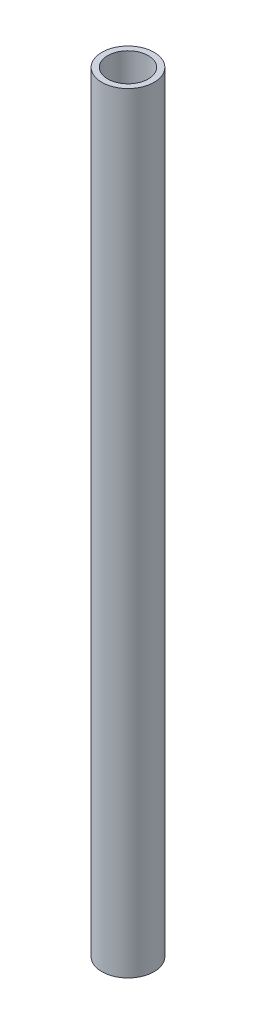
ISO-10303-21;
HEADER;
FILE_DESCRIPTION(('STEP AP214'),'2;1');
FILE_NAME('part.step','',(''),(''),'','','');
FILE_SCHEMA(('AUTOMOTIVE_DESIGN { 1 0 10303 214 1 1 1 1 }'));
ENDSEC;
DATA;
#1=APPLICATION_CONTEXT('core data for automotive mechanical design processes');
#2=APPLICATION_PROTOCOL_DEFINITION('international standard','automotive_design',2000,#1);
#3=PRODUCT_CONTEXT('',#1,'mechanical');
#4=PRODUCT('Part','Part','',(#3));
#5=PRODUCT_RELATED_PRODUCT_CATEGORY('part','',(#4));
#6=PRODUCT_DEFINITION_FORMATION('','',#4);
#7=PRODUCT_DEFINITION_CONTEXT('part definition',#1,'design');
#8=PRODUCT_DEFINITION('design','',#6,#7);
#9=PRODUCT_DEFINITION_SHAPE('','',#8);
#10=(LENGTH_UNIT() NAMED_UNIT(*) SI_UNIT(.MILLI.,.METRE.));
#11=(NAMED_UNIT(*) PLANE_ANGLE_UNIT() SI_UNIT($,.RADIAN.));
#12=(NAMED_UNIT(*) SI_UNIT($,.STERADIAN.) SOLID_ANGLE_UNIT());
#13=UNCERTAINTY_MEASURE_WITH_UNIT(LENGTH_MEASURE(1.E-05),#10,'distance_accuracy_value','');
#14=(GEOMETRIC_REPRESENTATION_CONTEXT(3) GLOBAL_UNCERTAINTY_ASSIGNED_CONTEXT((#13)) GLOBAL_UNIT_ASSIGNED_CONTEXT((#10,
#11,#12)) REPRESENTATION_CONTEXT('',''));
#15=CARTESIAN_POINT('',(0.,0.,0.));
#16=DIRECTION('',(0.,0.,1.));
#17=DIRECTION('',(1.,0.,0.));
#18=AXIS2_PLACEMENT_3D('',#15,#16,#17);
#19=CARTESIAN_POINT('',(0.,265.82,0.));
#20=DIRECTION('',(0.,1.,0.));
#21=DIRECTION('',(0.,0.,1.));
#22=AXIS2_PLACEMENT_3D('',#19,#20,#21);
#23=PLANE('',#22);
#24=CARTESIAN_POINT('',(0.,265.82,0.));
#25=DIRECTION('',(0.,1.,0.));
#26=DIRECTION('',(0.,0.,1.));
#27=AXIS2_PLACEMENT_3D('',#24,#25,#26);
#28=CIRCLE('',#27,9.);
#29=CARTESIAN_POINT('',(0.,265.82,9.));
#30=VERTEX_POINT('',#29);
#31=EDGE_CURVE('E10',#30,#30,#28,.T.);
#32=ORIENTED_EDGE('',*,*,#31,.T.);
#33=EDGE_LOOP('',(#32));
#34=FACE_BOUND('',#33,.T.);
#35=CARTESIAN_POINT('',(0.,265.82,0.));
#36=DIRECTION('',(0.,1.,0.));
#37=DIRECTION('',(0.,0.,1.));
#38=AXIS2_PLACEMENT_3D('',#35,#36,#37);
#39=CIRCLE('',#38,7.);
#40=CARTESIAN_POINT('',(0.,265.82,7.));
#41=VERTEX_POINT('',#40);
#42=EDGE_CURVE('E41',#41,#41,#39,.T.);
#43=ORIENTED_EDGE('',*,*,#42,.F.);
#44=EDGE_LOOP('',(#43));
#45=FACE_BOUND('',#44,.T.);
#46=ADVANCED_FACE('F30',(#34,#45),#23,.T.);
#47=CARTESIAN_POINT('',(0.,0.,0.));
#48=DIRECTION('',(0.,1.,0.));
#49=DIRECTION('',(0.,0.,1.));
#50=AXIS2_PLACEMENT_3D('',#47,#48,#49);
#51=PLANE('',#50);
#52=CARTESIAN_POINT('',(0.,0.,0.));
#53=DIRECTION('',(0.,1.,0.));
#54=DIRECTION('',(0.,0.,1.));
#55=AXIS2_PLACEMENT_3D('',#52,#53,#54);
#56=CIRCLE('',#55,9.);
#57=CARTESIAN_POINT('',(0.,0.,9.));
#58=VERTEX_POINT('',#57);
#59=EDGE_CURVE('E34',#58,#58,#56,.T.);
#60=ORIENTED_EDGE('',*,*,#59,.F.);
#61=EDGE_LOOP('',(#60));
#62=FACE_BOUND('',#61,.T.);
#63=CARTESIAN_POINT('',(0.,0.,0.));
#64=DIRECTION('',(0.,1.,0.));
#65=DIRECTION('',(0.,0.,1.));
#66=AXIS2_PLACEMENT_3D('',#63,#64,#65);
#67=CIRCLE('',#66,7.);
#68=CARTESIAN_POINT('',(0.,0.,7.));
#69=VERTEX_POINT('',#68);
#70=EDGE_CURVE('E43',#69,#69,#67,.T.);
#71=ORIENTED_EDGE('',*,*,#70,.T.);
#72=EDGE_LOOP('',(#71));
#73=FACE_BOUND('',#72,.T.);
#74=ADVANCED_FACE('F53',(#62,#73),#51,.F.);
#75=CARTESIAN_POINT('',(0.,265.82,0.));
#76=DIRECTION('',(0.,-1.,0.));
#77=DIRECTION('',(0.,0.,-1.));
#78=AXIS2_PLACEMENT_3D('',#75,#76,#77);
#79=CYLINDRICAL_SURFACE('',#78,9.);
#80=ORIENTED_EDGE('',*,*,#31,.F.);
#81=EDGE_LOOP('',(#80));
#82=FACE_BOUND('',#81,.T.);
#83=ORIENTED_EDGE('',*,*,#59,.T.);
#84=EDGE_LOOP('',(#83));
#85=FACE_BOUND('',#84,.T.);
#86=ADVANCED_FACE('F32',(#82,#85),#79,.T.);
#87=CARTESIAN_POINT('',(0.,265.82,0.));
#88=DIRECTION('',(0.,-1.,0.));
#89=DIRECTION('',(0.,0.,-1.));
#90=AXIS2_PLACEMENT_3D('',#87,#88,#89);
#91=CYLINDRICAL_SURFACE('',#90,7.);
#92=ORIENTED_EDGE('',*,*,#42,.T.);
#93=EDGE_LOOP('',(#92));
#94=FACE_BOUND('',#93,.T.);
#95=ORIENTED_EDGE('',*,*,#70,.F.);
#96=EDGE_LOOP('',(#95));
#97=FACE_BOUND('',#96,.T.);
#98=ADVANCED_FACE('F49',(#94,#97),#91,.F.);
#99=CLOSED_SHELL('',(#46,#74,#86,#98));
#100=MANIFOLD_SOLID_BREP('B2',#99);
#101=ADVANCED_BREP_SHAPE_REPRESENTATION('',(#18,#100),#14);
#102=SHAPE_DEFINITION_REPRESENTATION(#9,#101);
ENDSEC;
END-ISO-10303-21;
